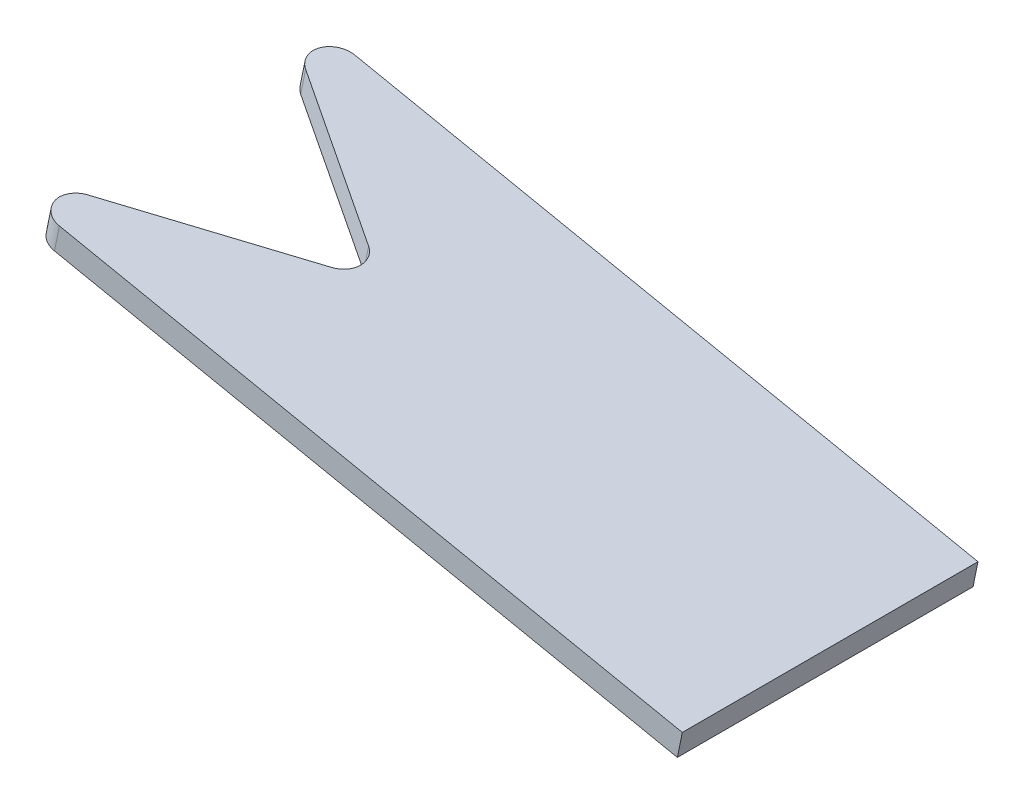
ISO-10303-21;
HEADER;
FILE_DESCRIPTION(('STEP AP214'),'2;1');
FILE_NAME('part.step','',(''),(''),'','','');
FILE_SCHEMA(('AUTOMOTIVE_DESIGN { 1 0 10303 214 1 1 1 1 }'));
ENDSEC;
DATA;
#1=APPLICATION_CONTEXT('core data for automotive mechanical design processes');
#2=APPLICATION_PROTOCOL_DEFINITION('international standard','automotive_design',2000,#1);
#3=PRODUCT_CONTEXT('',#1,'mechanical');
#4=PRODUCT('Part','Part','',(#3));
#5=PRODUCT_RELATED_PRODUCT_CATEGORY('part','',(#4));
#6=PRODUCT_DEFINITION_FORMATION('','',#4);
#7=PRODUCT_DEFINITION_CONTEXT('part definition',#1,'design');
#8=PRODUCT_DEFINITION('design','',#6,#7);
#9=PRODUCT_DEFINITION_SHAPE('','',#8);
#10=(LENGTH_UNIT() NAMED_UNIT(*) SI_UNIT(.MILLI.,.METRE.));
#11=(NAMED_UNIT(*) PLANE_ANGLE_UNIT() SI_UNIT($,.RADIAN.));
#12=(NAMED_UNIT(*) SI_UNIT($,.STERADIAN.) SOLID_ANGLE_UNIT());
#13=UNCERTAINTY_MEASURE_WITH_UNIT(LENGTH_MEASURE(1.E-05),#10,'distance_accuracy_value','');
#14=(GEOMETRIC_REPRESENTATION_CONTEXT(3) GLOBAL_UNCERTAINTY_ASSIGNED_CONTEXT((#13)) GLOBAL_UNIT_ASSIGNED_CONTEXT((#10,
#11,#12)) REPRESENTATION_CONTEXT('',''));
#15=CARTESIAN_POINT('',(0.,0.,0.));
#16=DIRECTION('',(0.,0.,1.));
#17=DIRECTION('',(1.,0.,0.));
#18=AXIS2_PLACEMENT_3D('',#15,#16,#17);
#19=CARTESIAN_POINT('',(0.,0.,180.));
#20=DIRECTION('',(-0.979795897113271,0.200000000000001,0.));
#21=DIRECTION('',(-0.200000000000001,-0.979795897113271,0.));
#22=AXIS2_PLACEMENT_3D('',#19,#20,#21);
#23=PLANE('',#22);
#24=DIRECTION('',(0.200000000000001,0.979795897113271,0.));
#25=VECTOR('',#24,1.);
#26=CARTESIAN_POINT('',(0.,0.,0.));
#27=LINE('',#26,#25);
#28=CARTESIAN_POINT('',(0.,0.,0.));
#29=VERTEX_POINT('',#28);
#30=CARTESIAN_POINT('',(3.00000000000002,14.6969384566991,0.));
#31=VERTEX_POINT('',#30);
#32=EDGE_CURVE('E135',#29,#31,#27,.T.);
#33=ORIENTED_EDGE('',*,*,#32,.T.);
#34=DIRECTION('',(0.,0.,-1.));
#35=VECTOR('',#34,1.);
#36=CARTESIAN_POINT('',(3.00000000000002,14.6969384566991,180.));
#37=LINE('',#36,#35);
#38=CARTESIAN_POINT('',(3.00000000000002,14.6969384566991,180.));
#39=VERTEX_POINT('',#38);
#40=EDGE_CURVE('E116',#39,#31,#37,.T.);
#41=ORIENTED_EDGE('',*,*,#40,.F.);
#42=DIRECTION('',(0.200000000000001,0.979795897113271,0.));
#43=VECTOR('',#42,1.);
#44=CARTESIAN_POINT('',(0.,0.,180.));
#45=LINE('',#44,#43);
#46=CARTESIAN_POINT('',(0.,0.,180.));
#47=VERTEX_POINT('',#46);
#48=EDGE_CURVE('E124',#47,#39,#45,.T.);
#49=ORIENTED_EDGE('',*,*,#48,.F.);
#50=DIRECTION('',(0.,0.,-1.));
#51=VECTOR('',#50,1.);
#52=CARTESIAN_POINT('',(0.,0.,180.));
#53=LINE('',#52,#51);
#54=EDGE_CURVE('E137',#47,#29,#53,.T.);
#55=ORIENTED_EDGE('',*,*,#54,.T.);
#56=EDGE_LOOP('',(#33,#41,#49,#55));
#57=FACE_BOUND('',#56,.T.);
#58=ADVANCED_FACE('F35',(#57),#23,.F.);
#59=CARTESIAN_POINT('',(3.00000000000002,14.6969384566991,180.));
#60=DIRECTION('',(-0.2,-0.979795897113271,0.));
#61=DIRECTION('',(0.979795897113271,-0.2,0.));
#62=AXIS2_PLACEMENT_3D('',#59,#60,#61);
#63=PLANE('',#62);
#64=DIRECTION('',(-0.979795897113271,0.2,0.));
#65=VECTOR('',#64,1.);
#66=CARTESIAN_POINT('',(3.00000000000002,14.6969384566991,0.));
#67=LINE('',#66,#65);
#68=CARTESIAN_POINT('',(-376.181012182836,92.096938456699,0.));
#69=VERTEX_POINT('',#68);
#70=EDGE_CURVE('E191',#31,#69,#67,.T.);
#71=ORIENTED_EDGE('',*,*,#70,.T.);
#72=CARTESIAN_POINT('',(-376.181012182836,92.0969384566991,13.));
#73=DIRECTION('',(-0.2,-0.979795897113271,0.));
#74=DIRECTION('',(0.979795897113271,-0.2,0.));
#75=AXIS2_PLACEMENT_3D('',#72,#73,#74);
#76=CIRCLE('',#75,13.);
#77=CARTESIAN_POINT('',(-388.915950728357,94.6964469018848,12.7472232502674));
#78=VERTEX_POINT('',#77);
#79=EDGE_CURVE('E162',#69,#78,#76,.F.);
#80=ORIENTED_EDGE('',*,*,#79,.T.);
#81=CARTESIAN_POINT('',(-376.181012182836,92.0969384566991,12.4944465005348));
#82=DIRECTION('',(-0.2,-0.979795897113271,0.));
#83=DIRECTION('',(0.979795897113271,-0.2,0.));
#84=AXIS2_PLACEMENT_3D('',#81,#82,#83);
#85=CIRCLE('',#84,13.);
#86=CARTESIAN_POINT('',(-382.549685514072,93.3969384566991,23.7527767497325));
#87=VERTEX_POINT('',#86);
#88=EDGE_CURVE('E159',#78,#87,#85,.F.);
#89=ORIENTED_EDGE('',*,*,#88,.T.);
#90=DIRECTION('',(-0.848528137423857,0.173205080756888,-0.5));
#91=VECTOR('',#90,1.);
#92=CARTESIAN_POINT('',(-388.918358845308,94.6969384566991,20.));
#93=LINE('',#92,#91);
#94=CARTESIAN_POINT('',(-289.230439599677,74.3482271507348,78.7416697508023));
#95=VERTEX_POINT('',#94);
#96=EDGE_CURVE('E185',#95,#87,#93,.T.);
#97=ORIENTED_EDGE('',*,*,#96,.F.);
#98=CARTESIAN_POINT('',(-295.599112930914,75.6482271507348,90.));
#99=DIRECTION('',(-0.2,-0.979795897113271,0.));
#100=DIRECTION('',(0.979795897113271,-0.2,0.));
#101=AXIS2_PLACEMENT_3D('',#98,#99,#100);
#102=CIRCLE('',#101,13.);
#103=CARTESIAN_POINT('',(-289.230439599677,74.3482271507348,101.258330249198));
#104=VERTEX_POINT('',#103);
#105=EDGE_CURVE('E43',#95,#104,#102,.T.);
#106=ORIENTED_EDGE('',*,*,#105,.T.);
#107=DIRECTION('',(0.848528137423857,-0.173205080756888,-0.5));
#108=VECTOR('',#107,1.);
#109=CARTESIAN_POINT('',(-270.124419605969,70.4482271507348,90.));
#110=LINE('',#109,#108);
#111=CARTESIAN_POINT('',(-382.549685514072,93.3969384566991,156.247223250267));
#112=VERTEX_POINT('',#111);
#113=EDGE_CURVE('E175',#112,#104,#110,.T.);
#114=ORIENTED_EDGE('',*,*,#113,.F.);
#115=CARTESIAN_POINT('',(-376.181012182836,92.0969384566991,167.505553499465));
#116=DIRECTION('',(-0.2,-0.979795897113271,0.));
#117=DIRECTION('',(0.979795897113271,-0.2,0.));
#118=AXIS2_PLACEMENT_3D('',#115,#116,#117);
#119=CIRCLE('',#118,13.);
#120=CARTESIAN_POINT('',(-388.915950728357,94.6964469018848,167.252776749731));
#121=VERTEX_POINT('',#120);
#122=EDGE_CURVE('E156',#112,#121,#119,.F.);
#123=ORIENTED_EDGE('',*,*,#122,.T.);
#124=CARTESIAN_POINT('',(-376.181012182836,92.0969384566991,167.));
#125=DIRECTION('',(-0.2,-0.979795897113271,0.));
#126=DIRECTION('',(0.979795897113271,-0.2,0.));
#127=AXIS2_PLACEMENT_3D('',#124,#125,#126);
#128=CIRCLE('',#127,13.);
#129=CARTESIAN_POINT('',(-376.181012182836,92.096938456699,180.));
#130=VERTEX_POINT('',#129);
#131=EDGE_CURVE('E119',#121,#130,#128,.F.);
#132=ORIENTED_EDGE('',*,*,#131,.T.);
#133=DIRECTION('',(-0.979795897113271,0.2,0.));
#134=VECTOR('',#133,1.);
#135=CARTESIAN_POINT('',(3.00000000000002,14.6969384566991,180.));
#136=LINE('',#135,#134);
#137=EDGE_CURVE('E111',#39,#130,#136,.T.);
#138=ORIENTED_EDGE('',*,*,#137,.F.);
#139=ORIENTED_EDGE('',*,*,#40,.T.);
#140=EDGE_LOOP('',(#71,#80,#89,#97,#106,#114,#123,#132,#138,#139));
#141=FACE_BOUND('',#140,.T.);
#142=ADVANCED_FACE('F114',(#141),#63,.F.);
#143=CARTESIAN_POINT('',(0.,0.,180.));
#144=DIRECTION('',(0.2,0.979795897113271,0.));
#145=DIRECTION('',(-0.979795897113271,0.2,0.));
#146=AXIS2_PLACEMENT_3D('',#143,#144,#145);
#147=PLANE('',#146);
#148=CARTESIAN_POINT('',(-379.181012182836,77.4,12.4944465005348));
#149=DIRECTION('',(0.2,0.979795897113271,0.));
#150=DIRECTION('',(-0.979795897113271,0.2,0.));
#151=AXIS2_PLACEMENT_3D('',#148,#149,#150);
#152=CIRCLE('',#151,13.);
#153=CARTESIAN_POINT('',(-385.549685514072,78.7,23.7527767497325));
#154=VERTEX_POINT('',#153);
#155=CARTESIAN_POINT('',(-391.915950728357,79.9995084451857,12.7472232502674));
#156=VERTEX_POINT('',#155);
#157=EDGE_CURVE('E149',#154,#156,#152,.F.);
#158=ORIENTED_EDGE('',*,*,#157,.T.);
#159=CARTESIAN_POINT('',(-379.181012182836,77.4,13.));
#160=DIRECTION('',(0.2,0.979795897113271,0.));
#161=DIRECTION('',(-0.979795897113271,0.2,0.));
#162=AXIS2_PLACEMENT_3D('',#159,#160,#161);
#163=CIRCLE('',#162,13.);
#164=CARTESIAN_POINT('',(-379.181012182836,77.4,0.));
#165=VERTEX_POINT('',#164);
#166=EDGE_CURVE('E151',#156,#165,#163,.F.);
#167=ORIENTED_EDGE('',*,*,#166,.T.);
#168=DIRECTION('',(0.979795897113271,-0.2,0.));
#169=VECTOR('',#168,1.);
#170=CARTESIAN_POINT('',(0.,0.,0.));
#171=LINE('',#170,#169);
#172=EDGE_CURVE('E132',#165,#29,#171,.T.);
#173=ORIENTED_EDGE('',*,*,#172,.T.);
#174=ORIENTED_EDGE('',*,*,#54,.F.);
#175=DIRECTION('',(0.979795897113271,-0.2,0.));
#176=VECTOR('',#175,1.);
#177=CARTESIAN_POINT('',(0.,0.,180.));
#178=LINE('',#177,#176);
#179=CARTESIAN_POINT('',(-379.181012182836,77.4,180.));
#180=VERTEX_POINT('',#179);
#181=EDGE_CURVE('E123',#180,#47,#178,.T.);
#182=ORIENTED_EDGE('',*,*,#181,.F.);
#183=CARTESIAN_POINT('',(-379.181012182836,77.4,167.));
#184=DIRECTION('',(0.2,0.979795897113271,0.));
#185=DIRECTION('',(-0.979795897113271,0.2,0.));
#186=AXIS2_PLACEMENT_3D('',#183,#184,#185);
#187=CIRCLE('',#186,13.);
#188=CARTESIAN_POINT('',(-391.915950728357,79.9995084451857,167.252776749731));
#189=VERTEX_POINT('',#188);
#190=EDGE_CURVE('E147',#180,#189,#187,.F.);
#191=ORIENTED_EDGE('',*,*,#190,.T.);
#192=CARTESIAN_POINT('',(-379.181012182836,77.4,167.505553499465));
#193=DIRECTION('',(0.2,0.979795897113271,0.));
#194=DIRECTION('',(-0.979795897113271,0.2,0.));
#195=AXIS2_PLACEMENT_3D('',#192,#193,#194);
#196=CIRCLE('',#195,13.);
#197=CARTESIAN_POINT('',(-385.549685514072,78.7,156.247223250267));
#198=VERTEX_POINT('',#197);
#199=EDGE_CURVE('E145',#189,#198,#196,.F.);
#200=ORIENTED_EDGE('',*,*,#199,.T.);
#201=DIRECTION('',(0.848528137423857,-0.173205080756888,-0.5));
#202=VECTOR('',#201,1.);
#203=CARTESIAN_POINT('',(-106.464871085566,21.7320508075689,-8.20508075688772));
#204=LINE('',#203,#202);
#205=CARTESIAN_POINT('',(-292.230439599677,59.6512886940357,101.258330249198));
#206=VERTEX_POINT('',#205);
#207=EDGE_CURVE('E136',#198,#206,#204,.T.);
#208=ORIENTED_EDGE('',*,*,#207,.T.);
#209=CARTESIAN_POINT('',(-298.599112930914,60.9512886940357,90.));
#210=DIRECTION('',(0.2,0.979795897113271,0.));
#211=DIRECTION('',(-0.979795897113271,0.2,0.));
#212=AXIS2_PLACEMENT_3D('',#209,#210,#211);
#213=CIRCLE('',#212,13.);
#214=CARTESIAN_POINT('',(-292.230439599677,59.6512886940357,78.7416697508023));
#215=VERTEX_POINT('',#214);
#216=EDGE_CURVE('E11',#206,#215,#213,.T.);
#217=ORIENTED_EDGE('',*,*,#216,.T.);
#218=DIRECTION('',(-0.848528137423857,0.173205080756888,-0.5));
#219=VECTOR('',#218,1.);
#220=CARTESIAN_POINT('',(-30.0973387174185,6.14359353944898,233.205080756888));
#221=LINE('',#220,#219);
#222=EDGE_CURVE('E139',#215,#154,#221,.T.);
#223=ORIENTED_EDGE('',*,*,#222,.T.);
#224=EDGE_LOOP('',(#158,#167,#173,#174,#182,#191,#200,#208,#217,#223));
#225=FACE_BOUND('',#224,.T.);
#226=ADVANCED_FACE('F198',(#225),#147,.F.);
#227=CARTESIAN_POINT('',(0.,0.,180.));
#228=DIRECTION('',(0.,0.,1.));
#229=DIRECTION('',(1.,0.,0.));
#230=AXIS2_PLACEMENT_3D('',#227,#228,#229);
#231=PLANE('',#230);
#232=ORIENTED_EDGE('',*,*,#137,.T.);
#233=DIRECTION('',(-0.2,-0.979795897113271,0.));
#234=VECTOR('',#233,1.);
#235=CARTESIAN_POINT('',(-379.181012182836,77.4,180.));
#236=LINE('',#235,#234);
#237=EDGE_CURVE('E167',#130,#180,#236,.T.);
#238=ORIENTED_EDGE('',*,*,#237,.T.);
#239=ORIENTED_EDGE('',*,*,#181,.T.);
#240=ORIENTED_EDGE('',*,*,#48,.T.);
#241=EDGE_LOOP('',(#232,#238,#239,#240));
#242=FACE_BOUND('',#241,.T.);
#243=ADVANCED_FACE('F127',(#242),#231,.T.);
#244=CARTESIAN_POINT('',(0.,0.,0.));
#245=DIRECTION('',(0.,0.,1.));
#246=DIRECTION('',(1.,0.,0.));
#247=AXIS2_PLACEMENT_3D('',#244,#245,#246);
#248=PLANE('',#247);
#249=ORIENTED_EDGE('',*,*,#172,.F.);
#250=DIRECTION('',(-0.2,-0.979795897113271,0.));
#251=VECTOR('',#250,1.);
#252=CARTESIAN_POINT('',(-379.181012182836,77.4,0.));
#253=LINE('',#252,#251);
#254=EDGE_CURVE('E153',#165,#69,#253,.F.);
#255=ORIENTED_EDGE('',*,*,#254,.T.);
#256=ORIENTED_EDGE('',*,*,#70,.F.);
#257=ORIENTED_EDGE('',*,*,#32,.F.);
#258=EDGE_LOOP('',(#249,#255,#256,#257));
#259=FACE_BOUND('',#258,.T.);
#260=ADVANCED_FACE('F202',(#259),#248,.F.);
#261=CARTESIAN_POINT('',(-424.918358845308,-81.6663230236897,20.));
#262=DIRECTION('',(0.489897948556636,-0.1,-0.866025403784439));
#263=DIRECTION('',(-0.870388279778489,0.,-0.492365963917331));
#264=AXIS2_PLACEMENT_3D('',#261,#262,#263);
#265=PLANE('',#264);
#266=ORIENTED_EDGE('',*,*,#222,.F.);
#267=DIRECTION('',(0.2,0.979795897113271,0.));
#268=VECTOR('',#267,1.);
#269=CARTESIAN_POINT('',(-289.230439599677,74.3482271507347,78.7416697508023));
#270=LINE('',#269,#268);
#271=EDGE_CURVE('E171',#215,#95,#270,.T.);
#272=ORIENTED_EDGE('',*,*,#271,.T.);
#273=ORIENTED_EDGE('',*,*,#96,.T.);
#274=DIRECTION('',(0.2,0.979795897113271,0.));
#275=VECTOR('',#274,1.);
#276=CARTESIAN_POINT('',(-418.549685514072,-82.9663230236897,23.7527767497325));
#277=LINE('',#276,#275);
#278=EDGE_CURVE('E164',#87,#154,#277,.F.);
#279=ORIENTED_EDGE('',*,*,#278,.T.);
#280=EDGE_LOOP('',(#266,#272,#273,#279));
#281=FACE_BOUND('',#280,.T.);
#282=ADVANCED_FACE('F184',(#281),#265,.F.);
#283=CARTESIAN_POINT('',(-306.124419605968,-105.915034329654,90.));
#284=DIRECTION('',(0.489897948556636,-0.1,0.866025403784439));
#285=DIRECTION('',(0.870388279778489,0.,-0.492365963917331));
#286=AXIS2_PLACEMENT_3D('',#283,#284,#285);
#287=PLANE('',#286);
#288=ORIENTED_EDGE('',*,*,#113,.T.);
#289=DIRECTION('',(0.2,0.979795897113271,0.));
#290=VECTOR('',#289,1.);
#291=CARTESIAN_POINT('',(-292.230439599677,59.6512886940357,101.258330249198));
#292=LINE('',#291,#290);
#293=EDGE_CURVE('E56',#104,#206,#292,.F.);
#294=ORIENTED_EDGE('',*,*,#293,.T.);
#295=ORIENTED_EDGE('',*,*,#207,.F.);
#296=DIRECTION('',(0.2,0.979795897113271,0.));
#297=VECTOR('',#296,1.);
#298=CARTESIAN_POINT('',(-418.549685514072,-82.9663230236897,156.247223250267));
#299=LINE('',#298,#297);
#300=EDGE_CURVE('E169',#198,#112,#299,.T.);
#301=ORIENTED_EDGE('',*,*,#300,.T.);
#302=EDGE_LOOP('',(#288,#294,#295,#301));
#303=FACE_BOUND('',#302,.T.);
#304=ADVANCED_FACE('F218',(#303),#287,.F.);
#305=CARTESIAN_POINT('',(-379.181012182836,77.4,12.4944465005348));
#306=DIRECTION('',(0.2,0.979795897113271,0.));
#307=DIRECTION('',(-0.979795897113271,0.2,0.));
#308=AXIS2_PLACEMENT_3D('',#305,#306,#307);
#309=CYLINDRICAL_SURFACE('',#308,13.);
#310=ORIENTED_EDGE('',*,*,#278,.F.);
#311=ORIENTED_EDGE('',*,*,#88,.F.);
#312=DIRECTION('',(0.2,0.979795897113271,0.));
#313=VECTOR('',#312,1.);
#314=CARTESIAN_POINT('',(-390.415950728357,87.3479776735353,12.7472232502674));
#315=LINE('',#314,#313);
#316=EDGE_CURVE('E172',#156,#78,#315,.T.);
#317=ORIENTED_EDGE('',*,*,#316,.F.);
#318=ORIENTED_EDGE('',*,*,#157,.F.);
#319=EDGE_LOOP('',(#310,#311,#317,#318));
#320=FACE_BOUND('',#319,.T.);
#321=ADVANCED_FACE('F206',(#320),#309,.T.);
#322=CARTESIAN_POINT('',(-379.181012182836,77.4,13.));
#323=DIRECTION('',(-0.2,-0.979795897113271,0.));
#324=DIRECTION('',(0.979795897113271,-0.2,0.));
#325=AXIS2_PLACEMENT_3D('',#322,#323,#324);
#326=CYLINDRICAL_SURFACE('',#325,13.);
#327=ORIENTED_EDGE('',*,*,#79,.F.);
#328=ORIENTED_EDGE('',*,*,#254,.F.);
#329=ORIENTED_EDGE('',*,*,#166,.F.);
#330=ORIENTED_EDGE('',*,*,#316,.T.);
#331=EDGE_LOOP('',(#327,#328,#329,#330));
#332=FACE_BOUND('',#331,.T.);
#333=ADVANCED_FACE('F208',(#332),#326,.T.);
#334=CARTESIAN_POINT('',(-412.181012182836,-84.2663230236897,167.505553499465));
#335=DIRECTION('',(0.2,0.979795897113271,0.));
#336=DIRECTION('',(-0.979795897113271,0.2,0.));
#337=AXIS2_PLACEMENT_3D('',#334,#335,#336);
#338=CYLINDRICAL_SURFACE('',#337,13.);
#339=DIRECTION('',(0.2,0.979795897113271,0.));
#340=VECTOR('',#339,1.);
#341=CARTESIAN_POINT('',(-390.415950728357,87.3479776735352,167.252776749731));
#342=LINE('',#341,#340);
#343=EDGE_CURVE('E176',#121,#189,#342,.F.);
#344=ORIENTED_EDGE('',*,*,#343,.F.);
#345=ORIENTED_EDGE('',*,*,#122,.F.);
#346=ORIENTED_EDGE('',*,*,#300,.F.);
#347=ORIENTED_EDGE('',*,*,#199,.F.);
#348=EDGE_LOOP('',(#344,#345,#346,#347));
#349=FACE_BOUND('',#348,.T.);
#350=ADVANCED_FACE('F210',(#349),#338,.T.);
#351=CARTESIAN_POINT('',(-379.181012182836,77.4,167.));
#352=DIRECTION('',(0.2,0.979795897113271,0.));
#353=DIRECTION('',(-0.979795897113271,0.2,0.));
#354=AXIS2_PLACEMENT_3D('',#351,#352,#353);
#355=CYLINDRICAL_SURFACE('',#354,13.);
#356=ORIENTED_EDGE('',*,*,#131,.F.);
#357=ORIENTED_EDGE('',*,*,#343,.T.);
#358=ORIENTED_EDGE('',*,*,#190,.F.);
#359=ORIENTED_EDGE('',*,*,#237,.F.);
#360=EDGE_LOOP('',(#356,#357,#358,#359));
#361=FACE_BOUND('',#360,.T.);
#362=ADVANCED_FACE('F216',(#361),#355,.T.);
#363=CARTESIAN_POINT('',(-331.599112930914,-100.715034329654,90.));
#364=DIRECTION('',(-0.2,-0.979795897113271,0.));
#365=DIRECTION('',(0.979795897113271,-0.2,0.));
#366=AXIS2_PLACEMENT_3D('',#363,#364,#365);
#367=CYLINDRICAL_SURFACE('',#366,13.);
#368=ORIENTED_EDGE('',*,*,#216,.F.);
#369=ORIENTED_EDGE('',*,*,#293,.F.);
#370=ORIENTED_EDGE('',*,*,#105,.F.);
#371=ORIENTED_EDGE('',*,*,#271,.F.);
#372=EDGE_LOOP('',(#368,#369,#370,#371));
#373=FACE_BOUND('',#372,.T.);
#374=ADVANCED_FACE('F37',(#373),#367,.F.);
#375=CLOSED_SHELL('',(#58,#142,#226,#243,#260,#282,#304,#321,#333,#350,#362,#374));
#376=MANIFOLD_SOLID_BREP('B2',#375);
#377=ADVANCED_BREP_SHAPE_REPRESENTATION('',(#18,#376),#14);
#378=SHAPE_DEFINITION_REPRESENTATION(#9,#377);
ENDSEC;
END-ISO-10303-21;
